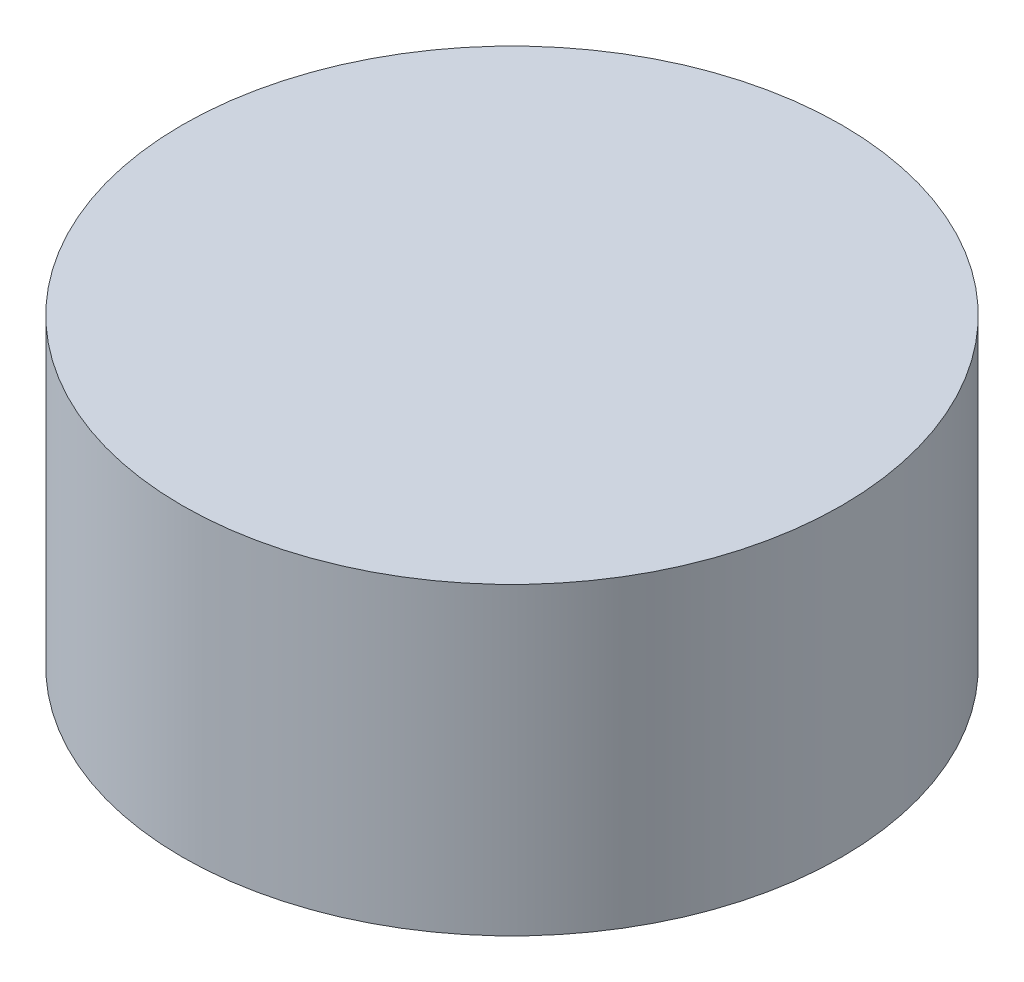
ISO-10303-21;
HEADER;
FILE_DESCRIPTION(('STEP AP214'),'2;1');
FILE_NAME('part.step','',(''),(''),'','','');
FILE_SCHEMA(('AUTOMOTIVE_DESIGN { 1 0 10303 214 1 1 1 1 }'));
ENDSEC;
DATA;
#1=APPLICATION_CONTEXT('core data for automotive mechanical design processes');
#2=APPLICATION_PROTOCOL_DEFINITION('international standard','automotive_design',2000,#1);
#3=PRODUCT_CONTEXT('',#1,'mechanical');
#4=PRODUCT('Part','Part','',(#3));
#5=PRODUCT_RELATED_PRODUCT_CATEGORY('part','',(#4));
#6=PRODUCT_DEFINITION_FORMATION('','',#4);
#7=PRODUCT_DEFINITION_CONTEXT('part definition',#1,'design');
#8=PRODUCT_DEFINITION('design','',#6,#7);
#9=PRODUCT_DEFINITION_SHAPE('','',#8);
#10=(LENGTH_UNIT() NAMED_UNIT(*) SI_UNIT(.MILLI.,.METRE.));
#11=(NAMED_UNIT(*) PLANE_ANGLE_UNIT() SI_UNIT($,.RADIAN.));
#12=(NAMED_UNIT(*) SI_UNIT($,.STERADIAN.) SOLID_ANGLE_UNIT());
#13=UNCERTAINTY_MEASURE_WITH_UNIT(LENGTH_MEASURE(1.E-05),#10,'distance_accuracy_value','');
#14=(GEOMETRIC_REPRESENTATION_CONTEXT(3) GLOBAL_UNCERTAINTY_ASSIGNED_CONTEXT((#13)) GLOBAL_UNIT_ASSIGNED_CONTEXT((#10,
#11,#12)) REPRESENTATION_CONTEXT('',''));
#15=CARTESIAN_POINT('',(0.,0.,0.));
#16=DIRECTION('',(0.,0.,1.));
#17=DIRECTION('',(1.,0.,0.));
#18=AXIS2_PLACEMENT_3D('',#15,#16,#17);
#19=CARTESIAN_POINT('',(0.,60.,0.));
#20=DIRECTION('',(0.,-1.,0.));
#21=DIRECTION('',(0.,0.,-1.));
#22=AXIS2_PLACEMENT_3D('',#19,#20,#21);
#23=CYLINDRICAL_SURFACE('',#22,64.9820195016375);
#24=CARTESIAN_POINT('',(0.,60.,0.));
#25=DIRECTION('',(0.,1.,0.));
#26=DIRECTION('',(0.,0.,1.));
#27=AXIS2_PLACEMENT_3D('',#24,#25,#26);
#28=CIRCLE('',#27,64.9820195016375);
#29=CARTESIAN_POINT('',(0.,60.,64.9820195016375));
#30=VERTEX_POINT('',#29);
#31=EDGE_CURVE('E10',#30,#30,#28,.T.);
#32=ORIENTED_EDGE('',*,*,#31,.F.);
#33=EDGE_LOOP('',(#32));
#34=FACE_BOUND('',#33,.T.);
#35=CARTESIAN_POINT('',(0.,0.,0.));
#36=DIRECTION('',(0.,1.,0.));
#37=DIRECTION('',(0.,0.,1.));
#38=AXIS2_PLACEMENT_3D('',#35,#36,#37);
#39=CIRCLE('',#38,64.9820195016375);
#40=CARTESIAN_POINT('',(0.,0.,64.9820195016375));
#41=VERTEX_POINT('',#40);
#42=EDGE_CURVE('E34',#41,#41,#39,.T.);
#43=ORIENTED_EDGE('',*,*,#42,.T.);
#44=EDGE_LOOP('',(#43));
#45=FACE_BOUND('',#44,.T.);
#46=ADVANCED_FACE('F31',(#34,#45),#23,.T.);
#47=CARTESIAN_POINT('',(0.,60.,0.));
#48=DIRECTION('',(0.,1.,0.));
#49=DIRECTION('',(0.,0.,1.));
#50=AXIS2_PLACEMENT_3D('',#47,#48,#49);
#51=PLANE('',#50);
#52=ORIENTED_EDGE('',*,*,#31,.T.);
#53=EDGE_LOOP('',(#52));
#54=FACE_BOUND('',#53,.T.);
#55=ADVANCED_FACE('F46',(#54),#51,.T.);
#56=CARTESIAN_POINT('',(0.,0.,0.));
#57=DIRECTION('',(0.,1.,0.));
#58=DIRECTION('',(0.,0.,1.));
#59=AXIS2_PLACEMENT_3D('',#56,#57,#58);
#60=PLANE('',#59);
#61=ORIENTED_EDGE('',*,*,#42,.F.);
#62=EDGE_LOOP('',(#61));
#63=FACE_BOUND('',#62,.T.);
#64=ADVANCED_FACE('F44',(#63),#60,.F.);
#65=CLOSED_SHELL('',(#46,#55,#64));
#66=MANIFOLD_SOLID_BREP('B2',#65);
#67=ADVANCED_BREP_SHAPE_REPRESENTATION('',(#18,#66),#14);
#68=SHAPE_DEFINITION_REPRESENTATION(#9,#67);
ENDSEC;
END-ISO-10303-21;
